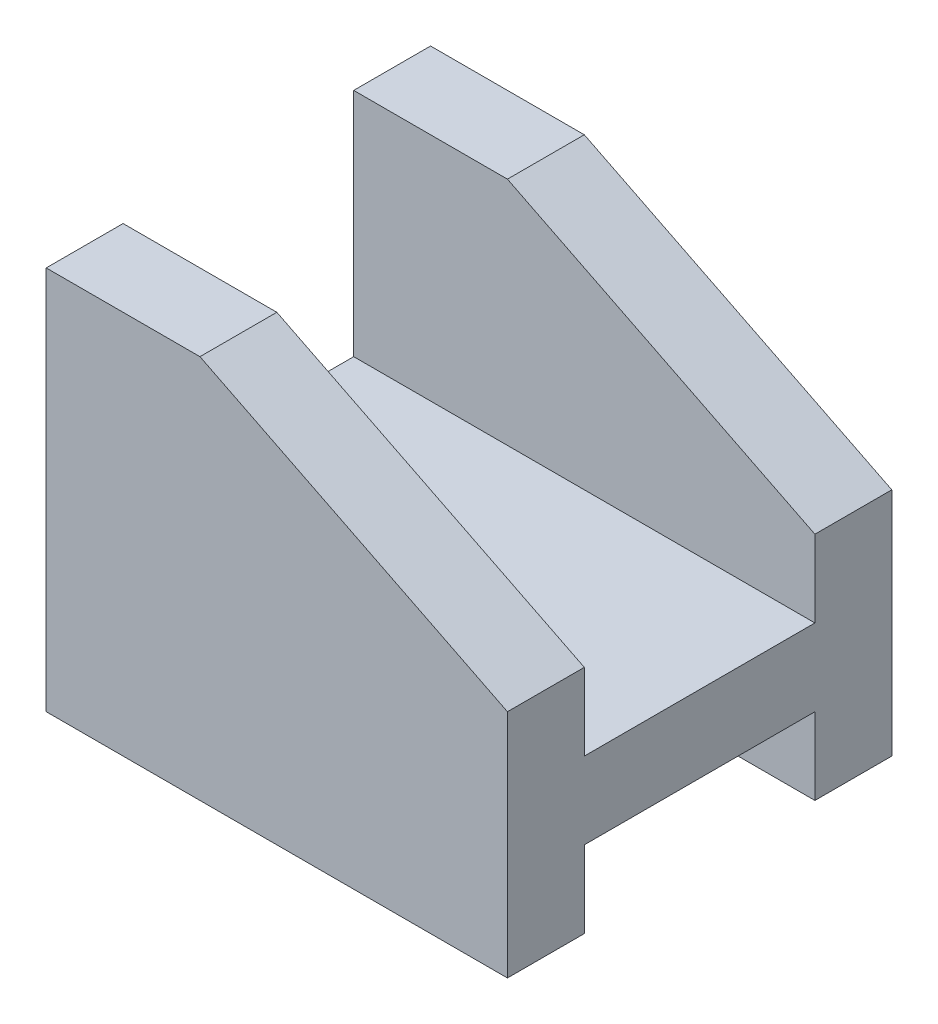
ISO-10303-21;
HEADER;
FILE_DESCRIPTION(('STEP AP214'),'2;1');
FILE_NAME('part.step','',(''),(''),'','','');
FILE_SCHEMA(('AUTOMOTIVE_DESIGN { 1 0 10303 214 1 1 1 1 }'));
ENDSEC;
DATA;
#1=APPLICATION_CONTEXT('core data for automotive mechanical design processes');
#2=APPLICATION_PROTOCOL_DEFINITION('international standard','automotive_design',2000,#1);
#3=PRODUCT_CONTEXT('',#1,'mechanical');
#4=PRODUCT('Part','Part','',(#3));
#5=PRODUCT_RELATED_PRODUCT_CATEGORY('part','',(#4));
#6=PRODUCT_DEFINITION_FORMATION('','',#4);
#7=PRODUCT_DEFINITION_CONTEXT('part definition',#1,'design');
#8=PRODUCT_DEFINITION('design','',#6,#7);
#9=PRODUCT_DEFINITION_SHAPE('','',#8);
#10=(LENGTH_UNIT() NAMED_UNIT(*) SI_UNIT(.MILLI.,.METRE.));
#11=(NAMED_UNIT(*) PLANE_ANGLE_UNIT() SI_UNIT($,.RADIAN.));
#12=(NAMED_UNIT(*) SI_UNIT($,.STERADIAN.) SOLID_ANGLE_UNIT());
#13=UNCERTAINTY_MEASURE_WITH_UNIT(LENGTH_MEASURE(1.E-05),#10,'distance_accuracy_value','');
#14=(GEOMETRIC_REPRESENTATION_CONTEXT(3) GLOBAL_UNCERTAINTY_ASSIGNED_CONTEXT((#13)) GLOBAL_UNIT_ASSIGNED_CONTEXT((#10,
#11,#12)) REPRESENTATION_CONTEXT('',''));
#15=CARTESIAN_POINT('',(0.,0.,0.));
#16=DIRECTION('',(0.,0.,1.));
#17=DIRECTION('',(1.,0.,0.));
#18=AXIS2_PLACEMENT_3D('',#15,#16,#17);
#19=CARTESIAN_POINT('',(19.05,0.,0.));
#20=DIRECTION('',(-1.,0.,0.));
#21=DIRECTION('',(0.,0.,1.));
#22=AXIS2_PLACEMENT_3D('',#19,#20,#21);
#23=PLANE('',#22);
#24=DIRECTION('',(0.,1.,0.));
#25=VECTOR('',#24,1.);
#26=CARTESIAN_POINT('',(19.05,-15.875,-15.875));
#27=LINE('',#26,#25);
#28=CARTESIAN_POINT('',(19.05,-15.875,-15.875));
#29=VERTEX_POINT('',#28);
#30=CARTESIAN_POINT('',(19.05,3.175,-15.875));
#31=VERTEX_POINT('',#30);
#32=EDGE_CURVE('E180',#29,#31,#27,.T.);
#33=ORIENTED_EDGE('',*,*,#32,.T.);
#34=DIRECTION('',(0.,0.,1.));
#35=VECTOR('',#34,1.);
#36=CARTESIAN_POINT('',(19.05,3.175,-15.875));
#37=LINE('',#36,#35);
#38=CARTESIAN_POINT('',(19.05,3.175,-9.525));
#39=VERTEX_POINT('',#38);
#40=EDGE_CURVE('E273',#31,#39,#37,.T.);
#41=ORIENTED_EDGE('',*,*,#40,.T.);
#42=DIRECTION('',(0.,1.,0.));
#43=VECTOR('',#42,1.);
#44=CARTESIAN_POINT('',(19.05,-3.175,-9.525));
#45=LINE('',#44,#43);
#46=CARTESIAN_POINT('',(19.05,-3.175,-9.525));
#47=VERTEX_POINT('',#46);
#48=EDGE_CURVE('E230',#47,#39,#45,.T.);
#49=ORIENTED_EDGE('',*,*,#48,.F.);
#50=DIRECTION('',(0.,0.,-1.));
#51=VECTOR('',#50,1.);
#52=CARTESIAN_POINT('',(19.05,-3.175,9.525));
#53=LINE('',#52,#51);
#54=CARTESIAN_POINT('',(19.05,-3.175,9.525));
#55=VERTEX_POINT('',#54);
#56=EDGE_CURVE('E234',#55,#47,#53,.T.);
#57=ORIENTED_EDGE('',*,*,#56,.F.);
#58=DIRECTION('',(0.,1.,0.));
#59=VECTOR('',#58,1.);
#60=CARTESIAN_POINT('',(19.05,-3.175,9.525));
#61=LINE('',#60,#59);
#62=CARTESIAN_POINT('',(19.05,3.17499999999999,9.525));
#63=VERTEX_POINT('',#62);
#64=EDGE_CURVE('E226',#55,#63,#61,.T.);
#65=ORIENTED_EDGE('',*,*,#64,.T.);
#66=CARTESIAN_POINT('',(19.05,3.175,15.875));
#67=VERTEX_POINT('',#66);
#68=EDGE_CURVE('E55',#63,#67,#37,.T.);
#69=ORIENTED_EDGE('',*,*,#68,.T.);
#70=DIRECTION('',(0.,-1.,0.));
#71=VECTOR('',#70,1.);
#72=CARTESIAN_POINT('',(19.05,-15.875,15.875));
#73=LINE('',#72,#71);
#74=CARTESIAN_POINT('',(19.05,-15.875,15.875));
#75=VERTEX_POINT('',#74);
#76=EDGE_CURVE('E156',#67,#75,#73,.T.);
#77=ORIENTED_EDGE('',*,*,#76,.T.);
#78=DIRECTION('',(0.,0.,-1.));
#79=VECTOR('',#78,1.);
#80=CARTESIAN_POINT('',(19.05,-15.875,15.875));
#81=LINE('',#80,#79);
#82=CARTESIAN_POINT('',(19.05,-15.875,9.525));
#83=VERTEX_POINT('',#82);
#84=EDGE_CURVE('E175',#75,#83,#81,.T.);
#85=ORIENTED_EDGE('',*,*,#84,.T.);
#86=DIRECTION('',(0.,-1.,0.));
#87=VECTOR('',#86,1.);
#88=CARTESIAN_POINT('',(19.05,0.,9.525));
#89=LINE('',#88,#87);
#90=CARTESIAN_POINT('',(19.05,-9.525,9.525));
#91=VERTEX_POINT('',#90);
#92=EDGE_CURVE('E261',#91,#83,#89,.T.);
#93=ORIENTED_EDGE('',*,*,#92,.F.);
#94=DIRECTION('',(0.,0.,-1.));
#95=VECTOR('',#94,1.);
#96=CARTESIAN_POINT('',(19.05,-9.525,0.));
#97=LINE('',#96,#95);
#98=CARTESIAN_POINT('',(19.05,-9.525,-9.525));
#99=VERTEX_POINT('',#98);
#100=EDGE_CURVE('E264',#91,#99,#97,.T.);
#101=ORIENTED_EDGE('',*,*,#100,.T.);
#102=DIRECTION('',(0.,-1.,0.));
#103=VECTOR('',#102,1.);
#104=CARTESIAN_POINT('',(19.05,0.,-9.525));
#105=LINE('',#104,#103);
#106=CARTESIAN_POINT('',(19.05,-15.875,-9.525));
#107=VERTEX_POINT('',#106);
#108=EDGE_CURVE('E268',#99,#107,#105,.T.);
#109=ORIENTED_EDGE('',*,*,#108,.T.);
#110=EDGE_CURVE('E197',#107,#29,#81,.T.);
#111=ORIENTED_EDGE('',*,*,#110,.T.);
#112=EDGE_LOOP('',(#33,#41,#49,#57,#65,#69,#77,#85,#93,#101,#109,#111));
#113=FACE_BOUND('',#112,.T.);
#114=ADVANCED_FACE('F39',(#113),#23,.F.);
#115=CARTESIAN_POINT('',(-19.05,0.,0.));
#116=DIRECTION('',(-1.,0.,0.));
#117=DIRECTION('',(0.,0.,1.));
#118=AXIS2_PLACEMENT_3D('',#115,#116,#117);
#119=PLANE('',#118);
#120=DIRECTION('',(0.,0.,-1.));
#121=VECTOR('',#120,1.);
#122=CARTESIAN_POINT('',(-19.05,-15.875,15.875));
#123=LINE('',#122,#121);
#124=CARTESIAN_POINT('',(-19.05,-15.875,-9.525));
#125=VERTEX_POINT('',#124);
#126=CARTESIAN_POINT('',(-19.05,-15.875,-15.875));
#127=VERTEX_POINT('',#126);
#128=EDGE_CURVE('E181',#125,#127,#123,.T.);
#129=ORIENTED_EDGE('',*,*,#128,.F.);
#130=DIRECTION('',(0.,-1.,0.));
#131=VECTOR('',#130,1.);
#132=CARTESIAN_POINT('',(-19.05,0.,-9.525));
#133=LINE('',#132,#131);
#134=CARTESIAN_POINT('',(-19.05,-9.525,-9.525));
#135=VERTEX_POINT('',#134);
#136=EDGE_CURVE('E258',#135,#125,#133,.T.);
#137=ORIENTED_EDGE('',*,*,#136,.F.);
#138=DIRECTION('',(0.,0.,-1.));
#139=VECTOR('',#138,1.);
#140=CARTESIAN_POINT('',(-19.05,-9.525,0.));
#141=LINE('',#140,#139);
#142=CARTESIAN_POINT('',(-19.05,-9.525,9.525));
#143=VERTEX_POINT('',#142);
#144=EDGE_CURVE('E255',#143,#135,#141,.T.);
#145=ORIENTED_EDGE('',*,*,#144,.F.);
#146=DIRECTION('',(0.,-1.,0.));
#147=VECTOR('',#146,1.);
#148=CARTESIAN_POINT('',(-19.05,0.,9.525));
#149=LINE('',#148,#147);
#150=CARTESIAN_POINT('',(-19.05,-15.875,9.525));
#151=VERTEX_POINT('',#150);
#152=EDGE_CURVE('E243',#143,#151,#149,.T.);
#153=ORIENTED_EDGE('',*,*,#152,.T.);
#154=CARTESIAN_POINT('',(-19.05,-15.875,15.875));
#155=VERTEX_POINT('',#154);
#156=EDGE_CURVE('E176',#155,#151,#123,.T.);
#157=ORIENTED_EDGE('',*,*,#156,.F.);
#158=DIRECTION('',(0.,-1.,0.));
#159=VECTOR('',#158,1.);
#160=CARTESIAN_POINT('',(-19.05,-15.875,15.875));
#161=LINE('',#160,#159);
#162=CARTESIAN_POINT('',(-19.05,15.875,15.875));
#163=VERTEX_POINT('',#162);
#164=EDGE_CURVE('E182',#163,#155,#161,.T.);
#165=ORIENTED_EDGE('',*,*,#164,.F.);
#166=DIRECTION('',(0.,0.,1.));
#167=VECTOR('',#166,1.);
#168=CARTESIAN_POINT('',(-19.05,15.875,15.875));
#169=LINE('',#168,#167);
#170=CARTESIAN_POINT('',(-19.05,15.875,9.525));
#171=VERTEX_POINT('',#170);
#172=EDGE_CURVE('E161',#171,#163,#169,.T.);
#173=ORIENTED_EDGE('',*,*,#172,.F.);
#174=DIRECTION('',(0.,1.,0.));
#175=VECTOR('',#174,1.);
#176=CARTESIAN_POINT('',(-19.05,-3.175,9.525));
#177=LINE('',#176,#175);
#178=CARTESIAN_POINT('',(-19.05,-3.175,9.525));
#179=VERTEX_POINT('',#178);
#180=EDGE_CURVE('E207',#179,#171,#177,.T.);
#181=ORIENTED_EDGE('',*,*,#180,.F.);
#182=DIRECTION('',(0.,0.,-1.));
#183=VECTOR('',#182,1.);
#184=CARTESIAN_POINT('',(-19.05,-3.175,9.525));
#185=LINE('',#184,#183);
#186=CARTESIAN_POINT('',(-19.05,-3.175,-9.525));
#187=VERTEX_POINT('',#186);
#188=EDGE_CURVE('E222',#179,#187,#185,.T.);
#189=ORIENTED_EDGE('',*,*,#188,.T.);
#190=DIRECTION('',(0.,1.,0.));
#191=VECTOR('',#190,1.);
#192=CARTESIAN_POINT('',(-19.05,-3.175,-9.525));
#193=LINE('',#192,#191);
#194=CARTESIAN_POINT('',(-19.05,15.875,-9.525));
#195=VERTEX_POINT('',#194);
#196=EDGE_CURVE('E218',#187,#195,#193,.T.);
#197=ORIENTED_EDGE('',*,*,#196,.T.);
#198=CARTESIAN_POINT('',(-19.05,15.875,-15.875));
#199=VERTEX_POINT('',#198);
#200=EDGE_CURVE('E185',#199,#195,#169,.T.);
#201=ORIENTED_EDGE('',*,*,#200,.F.);
#202=DIRECTION('',(0.,1.,0.));
#203=VECTOR('',#202,1.);
#204=CARTESIAN_POINT('',(-19.05,-15.875,-15.875));
#205=LINE('',#204,#203);
#206=EDGE_CURVE('E189',#127,#199,#205,.T.);
#207=ORIENTED_EDGE('',*,*,#206,.F.);
#208=EDGE_LOOP('',(#129,#137,#145,#153,#157,#165,#173,#181,#189,#197,#201,#207));
#209=FACE_BOUND('',#208,.T.);
#210=ADVANCED_FACE('F297',(#209),#119,.T.);
#211=CARTESIAN_POINT('',(19.05,-15.875,15.875));
#212=DIRECTION('',(0.,1.,0.));
#213=DIRECTION('',(0.,0.,1.));
#214=AXIS2_PLACEMENT_3D('',#211,#212,#213);
#215=PLANE('',#214);
#216=DIRECTION('',(1.,0.,0.));
#217=VECTOR('',#216,1.);
#218=CARTESIAN_POINT('',(-19.05,-15.875,-9.525));
#219=LINE('',#218,#217);
#220=EDGE_CURVE('E238',#125,#107,#219,.T.);
#221=ORIENTED_EDGE('',*,*,#220,.F.);
#222=ORIENTED_EDGE('',*,*,#128,.T.);
#223=DIRECTION('',(-1.,0.,0.));
#224=VECTOR('',#223,1.);
#225=CARTESIAN_POINT('',(19.05,-15.875,-15.875));
#226=LINE('',#225,#224);
#227=EDGE_CURVE('E169',#29,#127,#226,.T.);
#228=ORIENTED_EDGE('',*,*,#227,.F.);
#229=ORIENTED_EDGE('',*,*,#110,.F.);
#230=EDGE_LOOP('',(#221,#222,#228,#229));
#231=FACE_BOUND('',#230,.T.);
#232=ADVANCED_FACE('F292',(#231),#215,.F.);
#233=CARTESIAN_POINT('',(19.05,15.875,15.875));
#234=DIRECTION('',(0.,-1.,0.));
#235=DIRECTION('',(0.,0.,-1.));
#236=AXIS2_PLACEMENT_3D('',#233,#234,#235);
#237=PLANE('',#236);
#238=DIRECTION('',(-1.,0.,0.));
#239=VECTOR('',#238,1.);
#240=CARTESIAN_POINT('',(19.05,15.875,15.875));
#241=LINE('',#240,#239);
#242=CARTESIAN_POINT('',(-6.35,15.875,15.875));
#243=VERTEX_POINT('',#242);
#244=EDGE_CURVE('E153',#243,#163,#241,.T.);
#245=ORIENTED_EDGE('',*,*,#244,.F.);
#246=DIRECTION('',(0.,0.,1.));
#247=VECTOR('',#246,1.);
#248=CARTESIAN_POINT('',(-6.35,15.875,-15.875));
#249=LINE('',#248,#247);
#250=CARTESIAN_POINT('',(-6.35,15.875,9.525));
#251=VERTEX_POINT('',#250);
#252=EDGE_CURVE('E138',#251,#243,#249,.T.);
#253=ORIENTED_EDGE('',*,*,#252,.F.);
#254=DIRECTION('',(1.,0.,0.));
#255=VECTOR('',#254,1.);
#256=CARTESIAN_POINT('',(-19.05,15.875,9.525));
#257=LINE('',#256,#255);
#258=EDGE_CURVE('E211',#171,#251,#257,.T.);
#259=ORIENTED_EDGE('',*,*,#258,.F.);
#260=ORIENTED_EDGE('',*,*,#172,.T.);
#261=EDGE_LOOP('',(#245,#253,#259,#260));
#262=FACE_BOUND('',#261,.T.);
#263=ADVANCED_FACE('F159',(#262),#237,.F.);
#264=CARTESIAN_POINT('',(19.05,-15.875,-15.875));
#265=DIRECTION('',(0.,0.,1.));
#266=DIRECTION('',(1.,0.,0.));
#267=AXIS2_PLACEMENT_3D('',#264,#265,#266);
#268=PLANE('',#267);
#269=DIRECTION('',(-1.,0.,0.));
#270=VECTOR('',#269,1.);
#271=CARTESIAN_POINT('',(19.05,15.875,-15.875));
#272=LINE('',#271,#270);
#273=CARTESIAN_POINT('',(-6.35,15.875,-15.875));
#274=VERTEX_POINT('',#273);
#275=EDGE_CURVE('E48',#274,#199,#272,.T.);
#276=ORIENTED_EDGE('',*,*,#275,.F.);
#277=DIRECTION('',(0.894427190999916,-0.447213595499958,0.));
#278=VECTOR('',#277,1.);
#279=CARTESIAN_POINT('',(19.05,3.175,-15.875));
#280=LINE('',#279,#278);
#281=EDGE_CURVE('E148',#274,#31,#280,.T.);
#282=ORIENTED_EDGE('',*,*,#281,.T.);
#283=ORIENTED_EDGE('',*,*,#32,.F.);
#284=ORIENTED_EDGE('',*,*,#227,.T.);
#285=ORIENTED_EDGE('',*,*,#206,.T.);
#286=EDGE_LOOP('',(#276,#282,#283,#284,#285));
#287=FACE_BOUND('',#286,.T.);
#288=ADVANCED_FACE('F41',(#287),#268,.F.);
#289=DIRECTION('',(1.,0.,0.));
#290=VECTOR('',#289,1.);
#291=CARTESIAN_POINT('',(-19.05,15.875,-9.525));
#292=LINE('',#291,#290);
#293=CARTESIAN_POINT('',(-6.35000000000002,15.875,-9.525));
#294=VERTEX_POINT('',#293);
#295=EDGE_CURVE('E206',#195,#294,#292,.T.);
#296=ORIENTED_EDGE('',*,*,#295,.T.);
#297=EDGE_CURVE('E63',#274,#294,#249,.T.);
#298=ORIENTED_EDGE('',*,*,#297,.F.);
#299=ORIENTED_EDGE('',*,*,#275,.T.);
#300=ORIENTED_EDGE('',*,*,#200,.T.);
#301=EDGE_LOOP('',(#296,#298,#299,#300));
#302=FACE_BOUND('',#301,.T.);
#303=ADVANCED_FACE('F301',(#302),#237,.F.);
#304=CARTESIAN_POINT('',(19.05,-15.875,15.875));
#305=DIRECTION('',(0.,0.,-1.));
#306=DIRECTION('',(-1.,0.,0.));
#307=AXIS2_PLACEMENT_3D('',#304,#305,#306);
#308=PLANE('',#307);
#309=ORIENTED_EDGE('',*,*,#76,.F.);
#310=DIRECTION('',(0.894427190999916,-0.447213595499958,0.));
#311=VECTOR('',#310,1.);
#312=CARTESIAN_POINT('',(19.05,3.175,15.875));
#313=LINE('',#312,#311);
#314=EDGE_CURVE('E141',#243,#67,#313,.T.);
#315=ORIENTED_EDGE('',*,*,#314,.F.);
#316=ORIENTED_EDGE('',*,*,#244,.T.);
#317=ORIENTED_EDGE('',*,*,#164,.T.);
#318=DIRECTION('',(-1.,0.,0.));
#319=VECTOR('',#318,1.);
#320=CARTESIAN_POINT('',(19.05,-15.875,15.875));
#321=LINE('',#320,#319);
#322=EDGE_CURVE('E164',#75,#155,#321,.T.);
#323=ORIENTED_EDGE('',*,*,#322,.F.);
#324=EDGE_LOOP('',(#309,#315,#316,#317,#323));
#325=FACE_BOUND('',#324,.T.);
#326=ADVANCED_FACE('F152',(#325),#308,.F.);
#327=ORIENTED_EDGE('',*,*,#156,.T.);
#328=DIRECTION('',(1.,0.,0.));
#329=VECTOR('',#328,1.);
#330=CARTESIAN_POINT('',(-19.05,-15.875,9.525));
#331=LINE('',#330,#329);
#332=EDGE_CURVE('E246',#151,#83,#331,.T.);
#333=ORIENTED_EDGE('',*,*,#332,.T.);
#334=ORIENTED_EDGE('',*,*,#84,.F.);
#335=ORIENTED_EDGE('',*,*,#322,.T.);
#336=EDGE_LOOP('',(#327,#333,#334,#335));
#337=FACE_BOUND('',#336,.T.);
#338=ADVANCED_FACE('F326',(#337),#215,.F.);
#339=CARTESIAN_POINT('',(-19.05,-3.175,9.525));
#340=DIRECTION('',(0.,-1.,0.));
#341=DIRECTION('',(0.,0.,-1.));
#342=AXIS2_PLACEMENT_3D('',#339,#340,#341);
#343=PLANE('',#342);
#344=DIRECTION('',(1.,0.,0.));
#345=VECTOR('',#344,1.);
#346=CARTESIAN_POINT('',(-19.05,-3.175,-9.525));
#347=LINE('',#346,#345);
#348=EDGE_CURVE('E203',#187,#47,#347,.T.);
#349=ORIENTED_EDGE('',*,*,#348,.F.);
#350=ORIENTED_EDGE('',*,*,#188,.F.);
#351=DIRECTION('',(1.,0.,0.));
#352=VECTOR('',#351,1.);
#353=CARTESIAN_POINT('',(-19.05,-3.175,9.525));
#354=LINE('',#353,#352);
#355=EDGE_CURVE('E193',#179,#55,#354,.T.);
#356=ORIENTED_EDGE('',*,*,#355,.T.);
#357=ORIENTED_EDGE('',*,*,#56,.T.);
#358=EDGE_LOOP('',(#349,#350,#356,#357));
#359=FACE_BOUND('',#358,.T.);
#360=ADVANCED_FACE('F323',(#359),#343,.F.);
#361=CARTESIAN_POINT('',(-19.05,-3.175,9.525));
#362=DIRECTION('',(0.,0.,-1.));
#363=DIRECTION('',(-1.,0.,0.));
#364=AXIS2_PLACEMENT_3D('',#361,#362,#363);
#365=PLANE('',#364);
#366=DIRECTION('',(-0.894427190999916,0.447213595499958,0.));
#367=VECTOR('',#366,1.);
#368=CARTESIAN_POINT('',(-8.89,17.145,9.525));
#369=LINE('',#368,#367);
#370=EDGE_CURVE('E142',#63,#251,#369,.T.);
#371=ORIENTED_EDGE('',*,*,#370,.F.);
#372=ORIENTED_EDGE('',*,*,#64,.F.);
#373=ORIENTED_EDGE('',*,*,#355,.F.);
#374=ORIENTED_EDGE('',*,*,#180,.T.);
#375=ORIENTED_EDGE('',*,*,#258,.T.);
#376=EDGE_LOOP('',(#371,#372,#373,#374,#375));
#377=FACE_BOUND('',#376,.T.);
#378=ADVANCED_FACE('F355',(#377),#365,.T.);
#379=CARTESIAN_POINT('',(-19.05,-3.175,-9.525));
#380=DIRECTION('',(0.,0.,-1.));
#381=DIRECTION('',(-1.,0.,0.));
#382=AXIS2_PLACEMENT_3D('',#379,#380,#381);
#383=PLANE('',#382);
#384=ORIENTED_EDGE('',*,*,#48,.T.);
#385=DIRECTION('',(-0.894427190999916,0.447213595499958,0.));
#386=VECTOR('',#385,1.);
#387=CARTESIAN_POINT('',(-8.89,17.145,-9.525));
#388=LINE('',#387,#386);
#389=EDGE_CURVE('E11',#39,#294,#388,.T.);
#390=ORIENTED_EDGE('',*,*,#389,.T.);
#391=ORIENTED_EDGE('',*,*,#295,.F.);
#392=ORIENTED_EDGE('',*,*,#196,.F.);
#393=ORIENTED_EDGE('',*,*,#348,.T.);
#394=EDGE_LOOP('',(#384,#390,#391,#392,#393));
#395=FACE_BOUND('',#394,.T.);
#396=ADVANCED_FACE('F303',(#395),#383,.F.);
#397=CARTESIAN_POINT('',(-19.05,0.,-9.525));
#398=DIRECTION('',(0.,0.,1.));
#399=DIRECTION('',(1.,0.,0.));
#400=AXIS2_PLACEMENT_3D('',#397,#398,#399);
#401=PLANE('',#400);
#402=DIRECTION('',(1.,0.,0.));
#403=VECTOR('',#402,1.);
#404=CARTESIAN_POINT('',(-19.05,-9.525,-9.525));
#405=LINE('',#404,#403);
#406=EDGE_CURVE('E239',#135,#99,#405,.T.);
#407=ORIENTED_EDGE('',*,*,#406,.F.);
#408=ORIENTED_EDGE('',*,*,#136,.T.);
#409=ORIENTED_EDGE('',*,*,#220,.T.);
#410=ORIENTED_EDGE('',*,*,#108,.F.);
#411=EDGE_LOOP('',(#407,#408,#409,#410));
#412=FACE_BOUND('',#411,.T.);
#413=ADVANCED_FACE('F374',(#412),#401,.T.);
#414=CARTESIAN_POINT('',(-19.05,0.,9.525));
#415=DIRECTION('',(0.,0.,1.));
#416=DIRECTION('',(0.,-1.,0.));
#417=AXIS2_PLACEMENT_3D('',#414,#415,#416);
#418=PLANE('',#417);
#419=ORIENTED_EDGE('',*,*,#332,.F.);
#420=ORIENTED_EDGE('',*,*,#152,.F.);
#421=DIRECTION('',(1.,0.,0.));
#422=VECTOR('',#421,1.);
#423=CARTESIAN_POINT('',(-19.05,-9.525,9.525));
#424=LINE('',#423,#422);
#425=EDGE_CURVE('E242',#143,#91,#424,.T.);
#426=ORIENTED_EDGE('',*,*,#425,.T.);
#427=ORIENTED_EDGE('',*,*,#92,.T.);
#428=EDGE_LOOP('',(#419,#420,#426,#427));
#429=FACE_BOUND('',#428,.T.);
#430=ADVANCED_FACE('F312',(#429),#418,.F.);
#431=CARTESIAN_POINT('',(-19.05,-9.525,0.));
#432=DIRECTION('',(0.,-1.,0.));
#433=DIRECTION('',(0.,0.,-1.));
#434=AXIS2_PLACEMENT_3D('',#431,#432,#433);
#435=PLANE('',#434);
#436=ORIENTED_EDGE('',*,*,#425,.F.);
#437=ORIENTED_EDGE('',*,*,#144,.T.);
#438=ORIENTED_EDGE('',*,*,#406,.T.);
#439=ORIENTED_EDGE('',*,*,#100,.F.);
#440=EDGE_LOOP('',(#436,#437,#438,#439));
#441=FACE_BOUND('',#440,.T.);
#442=ADVANCED_FACE('F306',(#441),#435,.T.);
#443=CARTESIAN_POINT('',(19.05,3.175,-15.875));
#444=DIRECTION('',(-0.447213595499958,-0.894427190999916,0.));
#445=DIRECTION('',(0.894427190999916,-0.447213595499958,0.));
#446=AXIS2_PLACEMENT_3D('',#443,#444,#445);
#447=PLANE('',#446);
#448=ORIENTED_EDGE('',*,*,#40,.F.);
#449=ORIENTED_EDGE('',*,*,#281,.F.);
#450=ORIENTED_EDGE('',*,*,#297,.T.);
#451=ORIENTED_EDGE('',*,*,#389,.F.);
#452=EDGE_LOOP('',(#448,#449,#450,#451));
#453=FACE_BOUND('',#452,.T.);
#454=ADVANCED_FACE('F304',(#453),#447,.F.);
#455=ORIENTED_EDGE('',*,*,#370,.T.);
#456=ORIENTED_EDGE('',*,*,#252,.T.);
#457=ORIENTED_EDGE('',*,*,#314,.T.);
#458=ORIENTED_EDGE('',*,*,#68,.F.);
#459=EDGE_LOOP('',(#455,#456,#457,#458));
#460=FACE_BOUND('',#459,.T.);
#461=ADVANCED_FACE('F140',(#460),#447,.F.);
#462=CLOSED_SHELL('',(#114,#210,#232,#263,#288,#303,#326,#338,#360,#378,#396,#413,#430,#442,
#454,#461));
#463=MANIFOLD_SOLID_BREP('B2',#462);
#464=ADVANCED_BREP_SHAPE_REPRESENTATION('',(#18,#463),#14);
#465=SHAPE_DEFINITION_REPRESENTATION(#9,#464);
ENDSEC;
END-ISO-10303-21;
